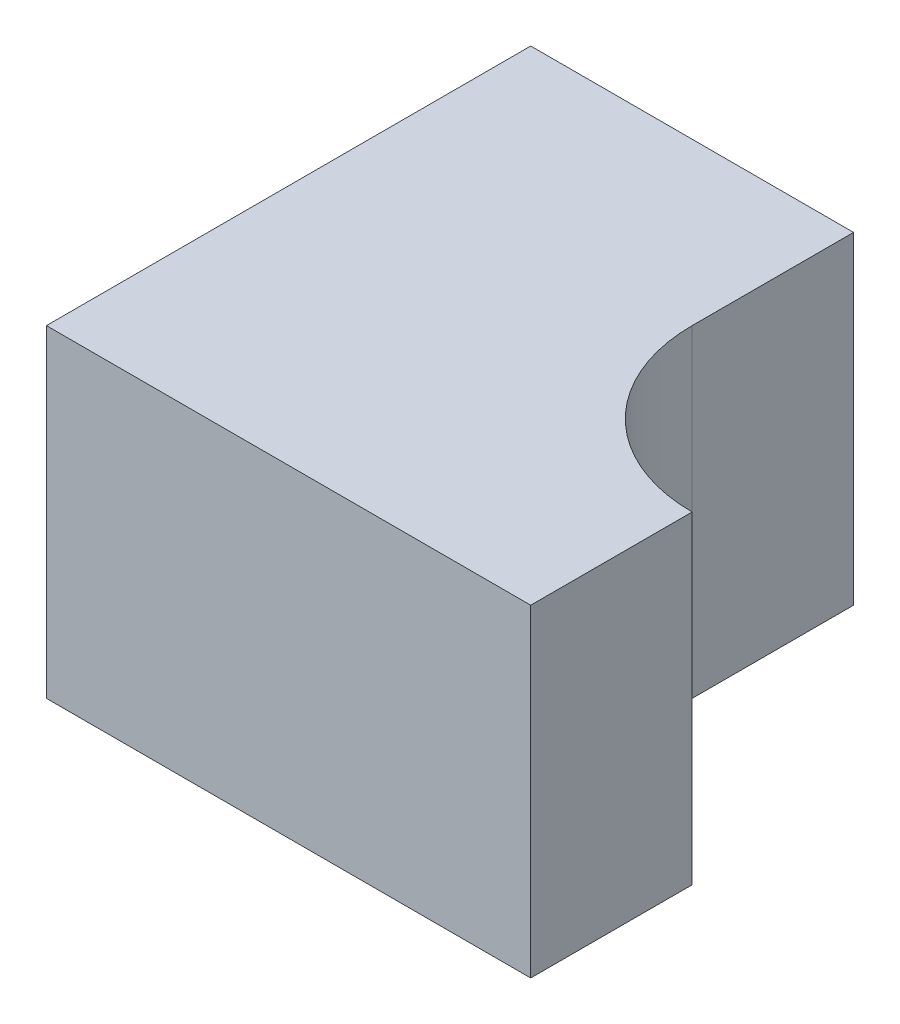
ISO-10303-21;
HEADER;
FILE_DESCRIPTION(('STEP AP214'),'2;1');
FILE_NAME('part.step','',(''),(''),'','','');
FILE_SCHEMA(('AUTOMOTIVE_DESIGN { 1 0 10303 214 1 1 1 1 }'));
ENDSEC;
DATA;
#1=APPLICATION_CONTEXT('core data for automotive mechanical design processes');
#2=APPLICATION_PROTOCOL_DEFINITION('international standard','automotive_design',2000,#1);
#3=PRODUCT_CONTEXT('',#1,'mechanical');
#4=PRODUCT('Part','Part','',(#3));
#5=PRODUCT_RELATED_PRODUCT_CATEGORY('part','',(#4));
#6=PRODUCT_DEFINITION_FORMATION('','',#4);
#7=PRODUCT_DEFINITION_CONTEXT('part definition',#1,'design');
#8=PRODUCT_DEFINITION('design','',#6,#7);
#9=PRODUCT_DEFINITION_SHAPE('','',#8);
#10=(LENGTH_UNIT() NAMED_UNIT(*) SI_UNIT(.MILLI.,.METRE.));
#11=(NAMED_UNIT(*) PLANE_ANGLE_UNIT() SI_UNIT($,.RADIAN.));
#12=(NAMED_UNIT(*) SI_UNIT($,.STERADIAN.) SOLID_ANGLE_UNIT());
#13=UNCERTAINTY_MEASURE_WITH_UNIT(LENGTH_MEASURE(1.E-05),#10,'distance_accuracy_value','');
#14=(GEOMETRIC_REPRESENTATION_CONTEXT(3) GLOBAL_UNCERTAINTY_ASSIGNED_CONTEXT((#13)) GLOBAL_UNIT_ASSIGNED_CONTEXT((#10,
#11,#12)) REPRESENTATION_CONTEXT('',''));
#15=CARTESIAN_POINT('',(0.,0.,0.));
#16=DIRECTION('',(0.,0.,1.));
#17=DIRECTION('',(1.,0.,0.));
#18=AXIS2_PLACEMENT_3D('',#15,#16,#17);
#19=CARTESIAN_POINT('',(-20.,20.,0.));
#20=DIRECTION('',(0.,0.,1.));
#21=DIRECTION('',(1.,0.,0.));
#22=AXIS2_PLACEMENT_3D('',#19,#20,#21);
#23=PLANE('',#22);
#24=DIRECTION('',(-1.,0.,0.));
#25=VECTOR('',#24,1.);
#26=CARTESIAN_POINT('',(-20.,0.,0.));
#27=LINE('',#26,#25);
#28=CARTESIAN_POINT('',(0.,0.,0.));
#29=VERTEX_POINT('',#28);
#30=CARTESIAN_POINT('',(-20.,0.,0.));
#31=VERTEX_POINT('',#30);
#32=EDGE_CURVE('E128',#29,#31,#27,.T.);
#33=ORIENTED_EDGE('',*,*,#32,.T.);
#34=DIRECTION('',(0.,-1.,0.));
#35=VECTOR('',#34,1.);
#36=CARTESIAN_POINT('',(-20.,20.,0.));
#37=LINE('',#36,#35);
#38=CARTESIAN_POINT('',(-20.,20.,0.));
#39=VERTEX_POINT('',#38);
#40=EDGE_CURVE('E11',#39,#31,#37,.T.);
#41=ORIENTED_EDGE('',*,*,#40,.F.);
#42=DIRECTION('',(-1.,0.,0.));
#43=VECTOR('',#42,1.);
#44=CARTESIAN_POINT('',(-20.,20.,0.));
#45=LINE('',#44,#43);
#46=CARTESIAN_POINT('',(0.,20.,0.));
#47=VERTEX_POINT('',#46);
#48=EDGE_CURVE('E144',#47,#39,#45,.T.);
#49=ORIENTED_EDGE('',*,*,#48,.F.);
#50=DIRECTION('',(0.,-1.,0.));
#51=VECTOR('',#50,1.);
#52=CARTESIAN_POINT('',(0.,20.,0.));
#53=LINE('',#52,#51);
#54=EDGE_CURVE('E124',#47,#29,#53,.T.);
#55=ORIENTED_EDGE('',*,*,#54,.T.);
#56=EDGE_LOOP('',(#33,#41,#49,#55));
#57=FACE_BOUND('',#56,.T.);
#58=ADVANCED_FACE('F39',(#57),#23,.F.);
#59=CARTESIAN_POINT('',(-20.,20.,30.));
#60=DIRECTION('',(1.,0.,0.));
#61=DIRECTION('',(0.,0.,-1.));
#62=AXIS2_PLACEMENT_3D('',#59,#60,#61);
#63=PLANE('',#62);
#64=DIRECTION('',(0.,0.,1.));
#65=VECTOR('',#64,1.);
#66=CARTESIAN_POINT('',(-20.,0.,30.));
#67=LINE('',#66,#65);
#68=CARTESIAN_POINT('',(-20.,0.,30.));
#69=VERTEX_POINT('',#68);
#70=EDGE_CURVE('E132',#31,#69,#67,.T.);
#71=ORIENTED_EDGE('',*,*,#70,.T.);
#72=DIRECTION('',(0.,-1.,0.));
#73=VECTOR('',#72,1.);
#74=CARTESIAN_POINT('',(-20.,20.,30.));
#75=LINE('',#74,#73);
#76=CARTESIAN_POINT('',(-20.,20.,30.));
#77=VERTEX_POINT('',#76);
#78=EDGE_CURVE('E48',#77,#69,#75,.T.);
#79=ORIENTED_EDGE('',*,*,#78,.F.);
#80=DIRECTION('',(0.,0.,1.));
#81=VECTOR('',#80,1.);
#82=CARTESIAN_POINT('',(-20.,20.,30.));
#83=LINE('',#82,#81);
#84=EDGE_CURVE('E93',#39,#77,#83,.T.);
#85=ORIENTED_EDGE('',*,*,#84,.F.);
#86=ORIENTED_EDGE('',*,*,#40,.T.);
#87=EDGE_LOOP('',(#71,#79,#85,#86));
#88=FACE_BOUND('',#87,.T.);
#89=ADVANCED_FACE('F172',(#88),#63,.F.);
#90=CARTESIAN_POINT('',(10.,20.,30.));
#91=DIRECTION('',(0.,0.,-1.));
#92=DIRECTION('',(-1.,0.,0.));
#93=AXIS2_PLACEMENT_3D('',#90,#91,#92);
#94=PLANE('',#93);
#95=DIRECTION('',(1.,0.,0.));
#96=VECTOR('',#95,1.);
#97=CARTESIAN_POINT('',(10.,0.,30.));
#98=LINE('',#97,#96);
#99=CARTESIAN_POINT('',(10.,0.,30.));
#100=VERTEX_POINT('',#99);
#101=EDGE_CURVE('E135',#69,#100,#98,.T.);
#102=ORIENTED_EDGE('',*,*,#101,.T.);
#103=DIRECTION('',(0.,-1.,0.));
#104=VECTOR('',#103,1.);
#105=CARTESIAN_POINT('',(10.,20.,30.));
#106=LINE('',#105,#104);
#107=CARTESIAN_POINT('',(10.,20.,30.));
#108=VERTEX_POINT('',#107);
#109=EDGE_CURVE('E117',#108,#100,#106,.T.);
#110=ORIENTED_EDGE('',*,*,#109,.F.);
#111=DIRECTION('',(1.,0.,0.));
#112=VECTOR('',#111,1.);
#113=CARTESIAN_POINT('',(10.,20.,30.));
#114=LINE('',#113,#112);
#115=EDGE_CURVE('E106',#77,#108,#114,.T.);
#116=ORIENTED_EDGE('',*,*,#115,.F.);
#117=ORIENTED_EDGE('',*,*,#78,.T.);
#118=EDGE_LOOP('',(#102,#110,#116,#117));
#119=FACE_BOUND('',#118,.T.);
#120=ADVANCED_FACE('F154',(#119),#94,.F.);
#121=CARTESIAN_POINT('',(10.,20.,20.));
#122=DIRECTION('',(-1.,0.,0.));
#123=DIRECTION('',(0.,0.,1.));
#124=AXIS2_PLACEMENT_3D('',#121,#122,#123);
#125=PLANE('',#124);
#126=DIRECTION('',(0.,0.,-1.));
#127=VECTOR('',#126,1.);
#128=CARTESIAN_POINT('',(10.,0.,20.));
#129=LINE('',#128,#127);
#130=CARTESIAN_POINT('',(10.,0.,20.));
#131=VERTEX_POINT('',#130);
#132=EDGE_CURVE('E115',#100,#131,#129,.T.);
#133=ORIENTED_EDGE('',*,*,#132,.T.);
#134=DIRECTION('',(0.,-1.,0.));
#135=VECTOR('',#134,1.);
#136=CARTESIAN_POINT('',(10.,20.,20.));
#137=LINE('',#136,#135);
#138=CARTESIAN_POINT('',(10.,20.,20.));
#139=VERTEX_POINT('',#138);
#140=EDGE_CURVE('E112',#139,#131,#137,.T.);
#141=ORIENTED_EDGE('',*,*,#140,.F.);
#142=DIRECTION('',(0.,0.,-1.));
#143=VECTOR('',#142,1.);
#144=CARTESIAN_POINT('',(10.,20.,20.));
#145=LINE('',#144,#143);
#146=EDGE_CURVE('E100',#108,#139,#145,.T.);
#147=ORIENTED_EDGE('',*,*,#146,.F.);
#148=ORIENTED_EDGE('',*,*,#109,.T.);
#149=EDGE_LOOP('',(#133,#141,#147,#148));
#150=FACE_BOUND('',#149,.T.);
#151=ADVANCED_FACE('F113',(#150),#125,.F.);
#152=CARTESIAN_POINT('',(10.,20.,10.));
#153=DIRECTION('',(0.,-1.,0.));
#154=DIRECTION('',(0.,0.,-1.));
#155=AXIS2_PLACEMENT_3D('',#152,#153,#154);
#156=CYLINDRICAL_SURFACE('',#155,10.);
#157=CARTESIAN_POINT('',(10.,0.,10.));
#158=DIRECTION('',(0.,-1.,0.));
#159=DIRECTION('',(0.,0.,1.));
#160=AXIS2_PLACEMENT_3D('',#157,#158,#159);
#161=CIRCLE('',#160,10.);
#162=CARTESIAN_POINT('',(0.,0.,10.));
#163=VERTEX_POINT('',#162);
#164=EDGE_CURVE('E79',#131,#163,#161,.T.);
#165=ORIENTED_EDGE('',*,*,#164,.T.);
#166=DIRECTION('',(0.,-1.,0.));
#167=VECTOR('',#166,1.);
#168=CARTESIAN_POINT('',(0.,20.,10.));
#169=LINE('',#168,#167);
#170=CARTESIAN_POINT('',(0.,20.,10.));
#171=VERTEX_POINT('',#170);
#172=EDGE_CURVE('E118',#171,#163,#169,.T.);
#173=ORIENTED_EDGE('',*,*,#172,.F.);
#174=CARTESIAN_POINT('',(10.,20.,10.));
#175=DIRECTION('',(0.,-1.,0.));
#176=DIRECTION('',(0.,0.,1.));
#177=AXIS2_PLACEMENT_3D('',#174,#175,#176);
#178=CIRCLE('',#177,10.);
#179=EDGE_CURVE('E104',#139,#171,#178,.T.);
#180=ORIENTED_EDGE('',*,*,#179,.F.);
#181=ORIENTED_EDGE('',*,*,#140,.T.);
#182=EDGE_LOOP('',(#165,#173,#180,#181));
#183=FACE_BOUND('',#182,.T.);
#184=ADVANCED_FACE('F120',(#183),#156,.F.);
#185=CARTESIAN_POINT('',(0.,20.,0.));
#186=DIRECTION('',(-1.,0.,0.));
#187=DIRECTION('',(0.,0.,1.));
#188=AXIS2_PLACEMENT_3D('',#185,#186,#187);
#189=PLANE('',#188);
#190=DIRECTION('',(0.,0.,-1.));
#191=VECTOR('',#190,1.);
#192=CARTESIAN_POINT('',(0.,0.,0.));
#193=LINE('',#192,#191);
#194=EDGE_CURVE('E85',#163,#29,#193,.T.);
#195=ORIENTED_EDGE('',*,*,#194,.T.);
#196=ORIENTED_EDGE('',*,*,#54,.F.);
#197=DIRECTION('',(0.,0.,-1.));
#198=VECTOR('',#197,1.);
#199=CARTESIAN_POINT('',(0.,20.,0.));
#200=LINE('',#199,#198);
#201=EDGE_CURVE('E56',#171,#47,#200,.T.);
#202=ORIENTED_EDGE('',*,*,#201,.F.);
#203=ORIENTED_EDGE('',*,*,#172,.T.);
#204=EDGE_LOOP('',(#195,#196,#202,#203));
#205=FACE_BOUND('',#204,.T.);
#206=ADVANCED_FACE('F161',(#205),#189,.F.);
#207=CARTESIAN_POINT('',(10.,20.,10.));
#208=DIRECTION('',(0.,1.,0.));
#209=DIRECTION('',(0.,0.,1.));
#210=AXIS2_PLACEMENT_3D('',#207,#208,#209);
#211=PLANE('',#210);
#212=ORIENTED_EDGE('',*,*,#48,.T.);
#213=ORIENTED_EDGE('',*,*,#84,.T.);
#214=ORIENTED_EDGE('',*,*,#115,.T.);
#215=ORIENTED_EDGE('',*,*,#146,.T.);
#216=ORIENTED_EDGE('',*,*,#179,.T.);
#217=ORIENTED_EDGE('',*,*,#201,.T.);
#218=EDGE_LOOP('',(#212,#213,#214,#215,#216,#217));
#219=FACE_BOUND('',#218,.T.);
#220=ADVANCED_FACE('F102',(#219),#211,.T.);
#221=CARTESIAN_POINT('',(10.,0.,10.));
#222=DIRECTION('',(0.,1.,0.));
#223=DIRECTION('',(0.,0.,1.));
#224=AXIS2_PLACEMENT_3D('',#221,#222,#223);
#225=PLANE('',#224);
#226=ORIENTED_EDGE('',*,*,#32,.F.);
#227=ORIENTED_EDGE('',*,*,#194,.F.);
#228=ORIENTED_EDGE('',*,*,#164,.F.);
#229=ORIENTED_EDGE('',*,*,#132,.F.);
#230=ORIENTED_EDGE('',*,*,#101,.F.);
#231=ORIENTED_EDGE('',*,*,#70,.F.);
#232=EDGE_LOOP('',(#226,#227,#228,#229,#230,#231));
#233=FACE_BOUND('',#232,.T.);
#234=ADVANCED_FACE('F157',(#233),#225,.F.);
#235=CLOSED_SHELL('',(#58,#89,#120,#151,#184,#206,#220,#234));
#236=MANIFOLD_SOLID_BREP('B2',#235);
#237=ADVANCED_BREP_SHAPE_REPRESENTATION('',(#18,#236),#14);
#238=SHAPE_DEFINITION_REPRESENTATION(#9,#237);
ENDSEC;
END-ISO-10303-21;
